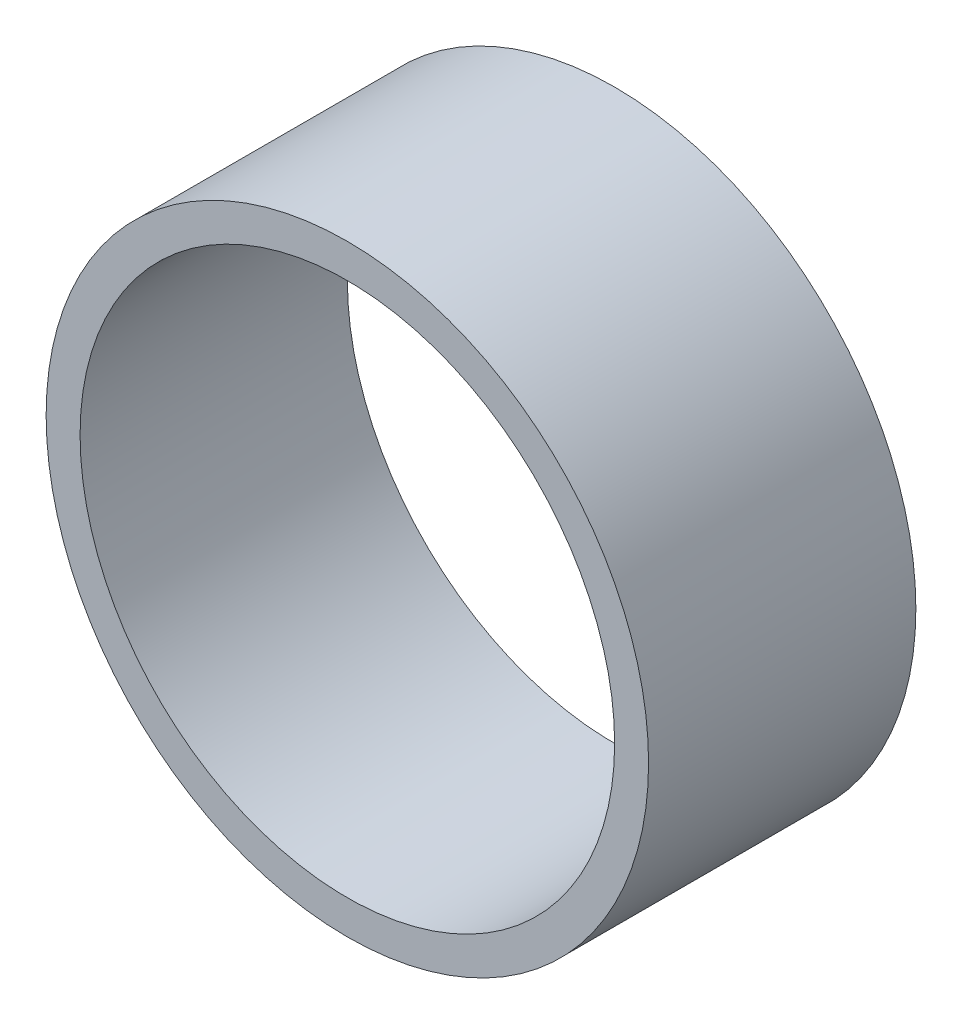
ISO-10303-21;
HEADER;
FILE_DESCRIPTION(('STEP AP214'),'2;1');
FILE_NAME('part.step','',(''),(''),'','','');
FILE_SCHEMA(('AUTOMOTIVE_DESIGN { 1 0 10303 214 1 1 1 1 }'));
ENDSEC;
DATA;
#1=APPLICATION_CONTEXT('core data for automotive mechanical design processes');
#2=APPLICATION_PROTOCOL_DEFINITION('international standard','automotive_design',2000,#1);
#3=PRODUCT_CONTEXT('',#1,'mechanical');
#4=PRODUCT('Part','Part','',(#3));
#5=PRODUCT_RELATED_PRODUCT_CATEGORY('part','',(#4));
#6=PRODUCT_DEFINITION_FORMATION('','',#4);
#7=PRODUCT_DEFINITION_CONTEXT('part definition',#1,'design');
#8=PRODUCT_DEFINITION('design','',#6,#7);
#9=PRODUCT_DEFINITION_SHAPE('','',#8);
#10=(LENGTH_UNIT() NAMED_UNIT(*) SI_UNIT(.MILLI.,.METRE.));
#11=(NAMED_UNIT(*) PLANE_ANGLE_UNIT() SI_UNIT($,.RADIAN.));
#12=(NAMED_UNIT(*) SI_UNIT($,.STERADIAN.) SOLID_ANGLE_UNIT());
#13=UNCERTAINTY_MEASURE_WITH_UNIT(LENGTH_MEASURE(1.E-05),#10,'distance_accuracy_value','');
#14=(GEOMETRIC_REPRESENTATION_CONTEXT(3) GLOBAL_UNCERTAINTY_ASSIGNED_CONTEXT((#13)) GLOBAL_UNIT_ASSIGNED_CONTEXT((#10,
#11,#12)) REPRESENTATION_CONTEXT('',''));
#15=CARTESIAN_POINT('',(0.,0.,0.));
#16=DIRECTION('',(0.,0.,1.));
#17=DIRECTION('',(1.,0.,0.));
#18=AXIS2_PLACEMENT_3D('',#15,#16,#17);
#19=CARTESIAN_POINT('',(0.,0.,6.35));
#20=DIRECTION('',(0.,0.,1.));
#21=DIRECTION('',(1.,0.,0.));
#22=AXIS2_PLACEMENT_3D('',#19,#20,#21);
#23=PLANE('',#22);
#24=CARTESIAN_POINT('',(0.,0.,6.35));
#25=DIRECTION('',(0.,0.,1.));
#26=DIRECTION('',(1.,0.,0.));
#27=AXIS2_PLACEMENT_3D('',#24,#25,#26);
#28=CIRCLE('',#27,14.3129);
#29=CARTESIAN_POINT('',(14.3129,0.,6.35));
#30=VERTEX_POINT('',#29);
#31=EDGE_CURVE('E10',#30,#30,#28,.T.);
#32=ORIENTED_EDGE('',*,*,#31,.T.);
#33=EDGE_LOOP('',(#32));
#34=FACE_BOUND('',#33,.T.);
#35=CARTESIAN_POINT('',(0.,0.,6.35));
#36=DIRECTION('',(0.,0.,1.));
#37=DIRECTION('',(1.,0.,0.));
#38=AXIS2_PLACEMENT_3D('',#35,#36,#37);
#39=CIRCLE('',#38,12.7);
#40=CARTESIAN_POINT('',(12.7,0.,6.35));
#41=VERTEX_POINT('',#40);
#42=EDGE_CURVE('E44',#41,#41,#39,.T.);
#43=ORIENTED_EDGE('',*,*,#42,.F.);
#44=EDGE_LOOP('',(#43));
#45=FACE_BOUND('',#44,.T.);
#46=ADVANCED_FACE('F33',(#34,#45),#23,.T.);
#47=CARTESIAN_POINT('',(0.,0.,-6.35));
#48=DIRECTION('',(0.,0.,1.));
#49=DIRECTION('',(1.,0.,0.));
#50=AXIS2_PLACEMENT_3D('',#47,#48,#49);
#51=PLANE('',#50);
#52=CARTESIAN_POINT('',(0.,0.,-6.35));
#53=DIRECTION('',(0.,0.,1.));
#54=DIRECTION('',(1.,0.,0.));
#55=AXIS2_PLACEMENT_3D('',#52,#53,#54);
#56=CIRCLE('',#55,14.3129);
#57=CARTESIAN_POINT('',(14.3129,0.,-6.35));
#58=VERTEX_POINT('',#57);
#59=EDGE_CURVE('E37',#58,#58,#56,.T.);
#60=ORIENTED_EDGE('',*,*,#59,.F.);
#61=EDGE_LOOP('',(#60));
#62=FACE_BOUND('',#61,.T.);
#63=CARTESIAN_POINT('',(0.,0.,-6.35));
#64=DIRECTION('',(0.,0.,1.));
#65=DIRECTION('',(1.,0.,0.));
#66=AXIS2_PLACEMENT_3D('',#63,#64,#65);
#67=CIRCLE('',#66,12.7);
#68=CARTESIAN_POINT('',(12.7,0.,-6.35));
#69=VERTEX_POINT('',#68);
#70=EDGE_CURVE('E46',#69,#69,#67,.T.);
#71=ORIENTED_EDGE('',*,*,#70,.T.);
#72=EDGE_LOOP('',(#71));
#73=FACE_BOUND('',#72,.T.);
#74=ADVANCED_FACE('F56',(#62,#73),#51,.F.);
#75=CARTESIAN_POINT('',(0.,0.,6.35));
#76=DIRECTION('',(0.,0.,-1.));
#77=DIRECTION('',(-1.,0.,0.));
#78=AXIS2_PLACEMENT_3D('',#75,#76,#77);
#79=CYLINDRICAL_SURFACE('',#78,14.3129);
#80=ORIENTED_EDGE('',*,*,#31,.F.);
#81=EDGE_LOOP('',(#80));
#82=FACE_BOUND('',#81,.T.);
#83=ORIENTED_EDGE('',*,*,#59,.T.);
#84=EDGE_LOOP('',(#83));
#85=FACE_BOUND('',#84,.T.);
#86=ADVANCED_FACE('F35',(#82,#85),#79,.T.);
#87=CARTESIAN_POINT('',(0.,0.,6.35));
#88=DIRECTION('',(0.,0.,-1.));
#89=DIRECTION('',(-1.,0.,0.));
#90=AXIS2_PLACEMENT_3D('',#87,#88,#89);
#91=CYLINDRICAL_SURFACE('',#90,12.7);
#92=ORIENTED_EDGE('',*,*,#42,.T.);
#93=EDGE_LOOP('',(#92));
#94=FACE_BOUND('',#93,.T.);
#95=ORIENTED_EDGE('',*,*,#70,.F.);
#96=EDGE_LOOP('',(#95));
#97=FACE_BOUND('',#96,.T.);
#98=ADVANCED_FACE('F52',(#94,#97),#91,.F.);
#99=CLOSED_SHELL('',(#46,#74,#86,#98));
#100=MANIFOLD_SOLID_BREP('B2',#99);
#101=ADVANCED_BREP_SHAPE_REPRESENTATION('',(#18,#100),#14);
#102=SHAPE_DEFINITION_REPRESENTATION(#9,#101);
ENDSEC;
END-ISO-10303-21;
